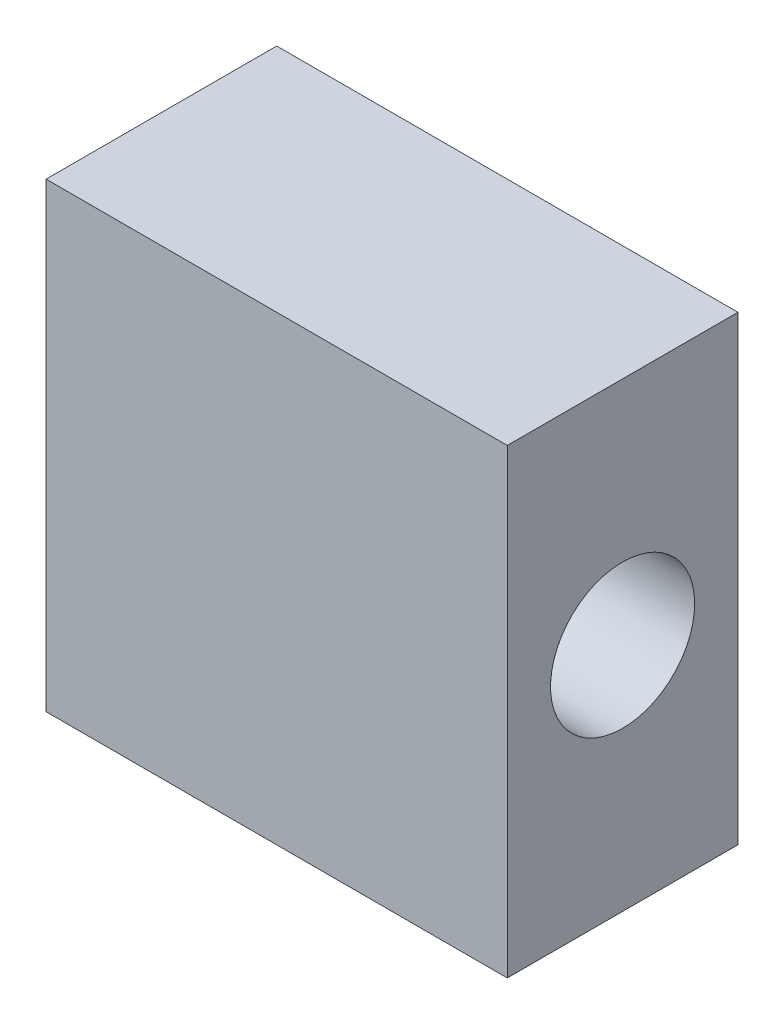
ISO-10303-21;
HEADER;
FILE_DESCRIPTION(('STEP AP214'),'2;1');
FILE_NAME('part.step','',(''),(''),'','','');
FILE_SCHEMA(('AUTOMOTIVE_DESIGN { 1 0 10303 214 1 1 1 1 }'));
ENDSEC;
DATA;
#1=APPLICATION_CONTEXT('core data for automotive mechanical design processes');
#2=APPLICATION_PROTOCOL_DEFINITION('international standard','automotive_design',2000,#1);
#3=PRODUCT_CONTEXT('',#1,'mechanical');
#4=PRODUCT('Part','Part','',(#3));
#5=PRODUCT_RELATED_PRODUCT_CATEGORY('part','',(#4));
#6=PRODUCT_DEFINITION_FORMATION('','',#4);
#7=PRODUCT_DEFINITION_CONTEXT('part definition',#1,'design');
#8=PRODUCT_DEFINITION('design','',#6,#7);
#9=PRODUCT_DEFINITION_SHAPE('','',#8);
#10=(LENGTH_UNIT() NAMED_UNIT(*) SI_UNIT(.MILLI.,.METRE.));
#11=(NAMED_UNIT(*) PLANE_ANGLE_UNIT() SI_UNIT($,.RADIAN.));
#12=(NAMED_UNIT(*) SI_UNIT($,.STERADIAN.) SOLID_ANGLE_UNIT());
#13=UNCERTAINTY_MEASURE_WITH_UNIT(LENGTH_MEASURE(1.E-05),#10,'distance_accuracy_value','');
#14=(GEOMETRIC_REPRESENTATION_CONTEXT(3) GLOBAL_UNCERTAINTY_ASSIGNED_CONTEXT((#13)) GLOBAL_UNIT_ASSIGNED_CONTEXT((#10,
#11,#12)) REPRESENTATION_CONTEXT('',''));
#15=CARTESIAN_POINT('',(0.,0.,0.));
#16=DIRECTION('',(0.,0.,1.));
#17=DIRECTION('',(1.,0.,0.));
#18=AXIS2_PLACEMENT_3D('',#15,#16,#17);
#19=CARTESIAN_POINT('',(0.,0.,25.4));
#20=DIRECTION('',(1.,0.,0.));
#21=DIRECTION('',(0.,0.,-1.));
#22=AXIS2_PLACEMENT_3D('',#19,#20,#21);
#23=PLANE('',#22);
#24=DIRECTION('',(0.,-1.,0.));
#25=VECTOR('',#24,1.);
#26=CARTESIAN_POINT('',(0.,0.,0.));
#27=LINE('',#26,#25);
#28=CARTESIAN_POINT('',(0.,50.8,0.));
#29=VERTEX_POINT('',#28);
#30=CARTESIAN_POINT('',(0.,0.,0.));
#31=VERTEX_POINT('',#30);
#32=EDGE_CURVE('E97',#29,#31,#27,.T.);
#33=ORIENTED_EDGE('',*,*,#32,.T.);
#34=DIRECTION('',(0.,0.,-1.));
#35=VECTOR('',#34,1.);
#36=CARTESIAN_POINT('',(0.,0.,25.4));
#37=LINE('',#36,#35);
#38=CARTESIAN_POINT('',(0.,0.,25.4));
#39=VERTEX_POINT('',#38);
#40=EDGE_CURVE('E11',#39,#31,#37,.T.);
#41=ORIENTED_EDGE('',*,*,#40,.F.);
#42=DIRECTION('',(0.,-1.,0.));
#43=VECTOR('',#42,1.);
#44=CARTESIAN_POINT('',(0.,0.,25.4));
#45=LINE('',#44,#43);
#46=CARTESIAN_POINT('',(0.,50.8,25.4));
#47=VERTEX_POINT('',#46);
#48=EDGE_CURVE('E85',#47,#39,#45,.T.);
#49=ORIENTED_EDGE('',*,*,#48,.F.);
#50=DIRECTION('',(0.,0.,-1.));
#51=VECTOR('',#50,1.);
#52=CARTESIAN_POINT('',(0.,50.8,25.4));
#53=LINE('',#52,#51);
#54=EDGE_CURVE('E93',#47,#29,#53,.T.);
#55=ORIENTED_EDGE('',*,*,#54,.T.);
#56=EDGE_LOOP('',(#33,#41,#49,#55));
#57=FACE_BOUND('',#56,.T.);
#58=ADVANCED_FACE('F34',(#57),#23,.F.);
#59=CARTESIAN_POINT('',(0.,0.,25.4));
#60=DIRECTION('',(0.,1.,0.));
#61=DIRECTION('',(0.,0.,1.));
#62=AXIS2_PLACEMENT_3D('',#59,#60,#61);
#63=PLANE('',#62);
#64=DIRECTION('',(1.,0.,0.));
#65=VECTOR('',#64,1.);
#66=CARTESIAN_POINT('',(0.,0.,0.));
#67=LINE('',#66,#65);
#68=CARTESIAN_POINT('',(50.8,0.,0.));
#69=VERTEX_POINT('',#68);
#70=EDGE_CURVE('E89',#31,#69,#67,.T.);
#71=ORIENTED_EDGE('',*,*,#70,.T.);
#72=DIRECTION('',(0.,0.,-1.));
#73=VECTOR('',#72,1.);
#74=CARTESIAN_POINT('',(50.8,0.,25.4));
#75=LINE('',#74,#73);
#76=CARTESIAN_POINT('',(50.8,0.,25.4));
#77=VERTEX_POINT('',#76);
#78=EDGE_CURVE('E42',#77,#69,#75,.T.);
#79=ORIENTED_EDGE('',*,*,#78,.F.);
#80=DIRECTION('',(1.,0.,0.));
#81=VECTOR('',#80,1.);
#82=CARTESIAN_POINT('',(0.,0.,25.4));
#83=LINE('',#82,#81);
#84=EDGE_CURVE('E80',#39,#77,#83,.T.);
#85=ORIENTED_EDGE('',*,*,#84,.F.);
#86=ORIENTED_EDGE('',*,*,#40,.T.);
#87=EDGE_LOOP('',(#71,#79,#85,#86));
#88=FACE_BOUND('',#87,.T.);
#89=ADVANCED_FACE('F88',(#88),#63,.F.);
#90=CARTESIAN_POINT('',(50.8,0.,25.4));
#91=DIRECTION('',(-1.,0.,0.));
#92=DIRECTION('',(0.,0.,1.));
#93=AXIS2_PLACEMENT_3D('',#90,#91,#92);
#94=PLANE('',#93);
#95=CARTESIAN_POINT('',(50.8,25.4,12.7));
#96=DIRECTION('',(1.,0.,0.));
#97=DIRECTION('',(0.,0.,-1.));
#98=AXIS2_PLACEMENT_3D('',#95,#96,#97);
#99=CIRCLE('',#98,7.9375);
#100=CARTESIAN_POINT('',(50.8,25.4,4.7625));
#101=VERTEX_POINT('',#100);
#102=EDGE_CURVE('E111',#101,#101,#99,.T.);
#103=ORIENTED_EDGE('',*,*,#102,.F.);
#104=EDGE_LOOP('',(#103));
#105=FACE_BOUND('',#104,.T.);
#106=DIRECTION('',(0.,1.,0.));
#107=VECTOR('',#106,1.);
#108=CARTESIAN_POINT('',(50.8,0.,0.));
#109=LINE('',#108,#107);
#110=CARTESIAN_POINT('',(50.8,50.8,0.));
#111=VERTEX_POINT('',#110);
#112=EDGE_CURVE('E67',#69,#111,#109,.T.);
#113=ORIENTED_EDGE('',*,*,#112,.T.);
#114=DIRECTION('',(0.,0.,-1.));
#115=VECTOR('',#114,1.);
#116=CARTESIAN_POINT('',(50.8,50.8,25.4));
#117=LINE('',#116,#115);
#118=CARTESIAN_POINT('',(50.8,50.8,25.4));
#119=VERTEX_POINT('',#118);
#120=EDGE_CURVE('E90',#119,#111,#117,.T.);
#121=ORIENTED_EDGE('',*,*,#120,.F.);
#122=DIRECTION('',(0.,1.,0.));
#123=VECTOR('',#122,1.);
#124=CARTESIAN_POINT('',(50.8,0.,25.4));
#125=LINE('',#124,#123);
#126=EDGE_CURVE('E83',#77,#119,#125,.T.);
#127=ORIENTED_EDGE('',*,*,#126,.F.);
#128=ORIENTED_EDGE('',*,*,#78,.T.);
#129=EDGE_LOOP('',(#113,#121,#127,#128));
#130=FACE_BOUND('',#129,.T.);
#131=ADVANCED_FACE('F91',(#105,#130),#94,.F.);
#132=CARTESIAN_POINT('',(0.,50.8,25.4));
#133=DIRECTION('',(0.,-1.,0.));
#134=DIRECTION('',(0.,0.,-1.));
#135=AXIS2_PLACEMENT_3D('',#132,#133,#134);
#136=PLANE('',#135);
#137=DIRECTION('',(-1.,0.,0.));
#138=VECTOR('',#137,1.);
#139=CARTESIAN_POINT('',(0.,50.8,0.));
#140=LINE('',#139,#138);
#141=EDGE_CURVE('E73',#111,#29,#140,.T.);
#142=ORIENTED_EDGE('',*,*,#141,.T.);
#143=ORIENTED_EDGE('',*,*,#54,.F.);
#144=DIRECTION('',(-1.,0.,0.));
#145=VECTOR('',#144,1.);
#146=CARTESIAN_POINT('',(0.,50.8,25.4));
#147=LINE('',#146,#145);
#148=EDGE_CURVE('E50',#119,#47,#147,.T.);
#149=ORIENTED_EDGE('',*,*,#148,.F.);
#150=ORIENTED_EDGE('',*,*,#120,.T.);
#151=EDGE_LOOP('',(#142,#143,#149,#150));
#152=FACE_BOUND('',#151,.T.);
#153=ADVANCED_FACE('F105',(#152),#136,.F.);
#154=CARTESIAN_POINT('',(0.,0.,25.4));
#155=DIRECTION('',(0.,0.,-1.));
#156=DIRECTION('',(-1.,0.,0.));
#157=AXIS2_PLACEMENT_3D('',#154,#155,#156);
#158=PLANE('',#157);
#159=ORIENTED_EDGE('',*,*,#48,.T.);
#160=ORIENTED_EDGE('',*,*,#84,.T.);
#161=ORIENTED_EDGE('',*,*,#126,.T.);
#162=ORIENTED_EDGE('',*,*,#148,.T.);
#163=EDGE_LOOP('',(#159,#160,#161,#162));
#164=FACE_BOUND('',#163,.T.);
#165=ADVANCED_FACE('F81',(#164),#158,.F.);
#166=CARTESIAN_POINT('',(0.,0.,0.));
#167=DIRECTION('',(0.,0.,-1.));
#168=DIRECTION('',(-1.,0.,0.));
#169=AXIS2_PLACEMENT_3D('',#166,#167,#168);
#170=PLANE('',#169);
#171=ORIENTED_EDGE('',*,*,#32,.F.);
#172=ORIENTED_EDGE('',*,*,#141,.F.);
#173=ORIENTED_EDGE('',*,*,#112,.F.);
#174=ORIENTED_EDGE('',*,*,#70,.F.);
#175=EDGE_LOOP('',(#171,#172,#173,#174));
#176=FACE_BOUND('',#175,.T.);
#177=ADVANCED_FACE('F108',(#176),#170,.T.);
#178=CARTESIAN_POINT('',(25.4,25.4,12.7));
#179=DIRECTION('',(1.,0.,0.));
#180=DIRECTION('',(0.,0.,-1.));
#181=AXIS2_PLACEMENT_3D('',#178,#179,#180);
#182=CYLINDRICAL_SURFACE('',#181,7.9375);
#183=CARTESIAN_POINT('',(25.4,25.4,12.7));
#184=DIRECTION('',(1.,0.,0.));
#185=DIRECTION('',(0.,0.,-1.));
#186=AXIS2_PLACEMENT_3D('',#183,#184,#185);
#187=CIRCLE('',#186,7.9375);
#188=CARTESIAN_POINT('',(25.4,25.4,4.7625));
#189=VERTEX_POINT('',#188);
#190=EDGE_CURVE('E100',#189,#189,#187,.T.);
#191=ORIENTED_EDGE('',*,*,#190,.F.);
#192=EDGE_LOOP('',(#191));
#193=FACE_BOUND('',#192,.T.);
#194=ORIENTED_EDGE('',*,*,#102,.T.);
#195=EDGE_LOOP('',(#194));
#196=FACE_BOUND('',#195,.T.);
#197=ADVANCED_FACE('F119',(#193,#196),#182,.F.);
#198=CARTESIAN_POINT('',(25.4,25.4,12.7));
#199=DIRECTION('',(1.,0.,0.));
#200=DIRECTION('',(0.,0.,-1.));
#201=AXIS2_PLACEMENT_3D('',#198,#199,#200);
#202=PLANE('',#201);
#203=ORIENTED_EDGE('',*,*,#190,.T.);
#204=EDGE_LOOP('',(#203));
#205=FACE_BOUND('',#204,.T.);
#206=ADVANCED_FACE('F117',(#205),#202,.T.);
#207=CLOSED_SHELL('',(#58,#89,#131,#153,#165,#177,#197,#206));
#208=MANIFOLD_SOLID_BREP('B2',#207);
#209=ADVANCED_BREP_SHAPE_REPRESENTATION('',(#18,#208),#14);
#210=SHAPE_DEFINITION_REPRESENTATION(#9,#209);
ENDSEC;
END-ISO-10303-21;
